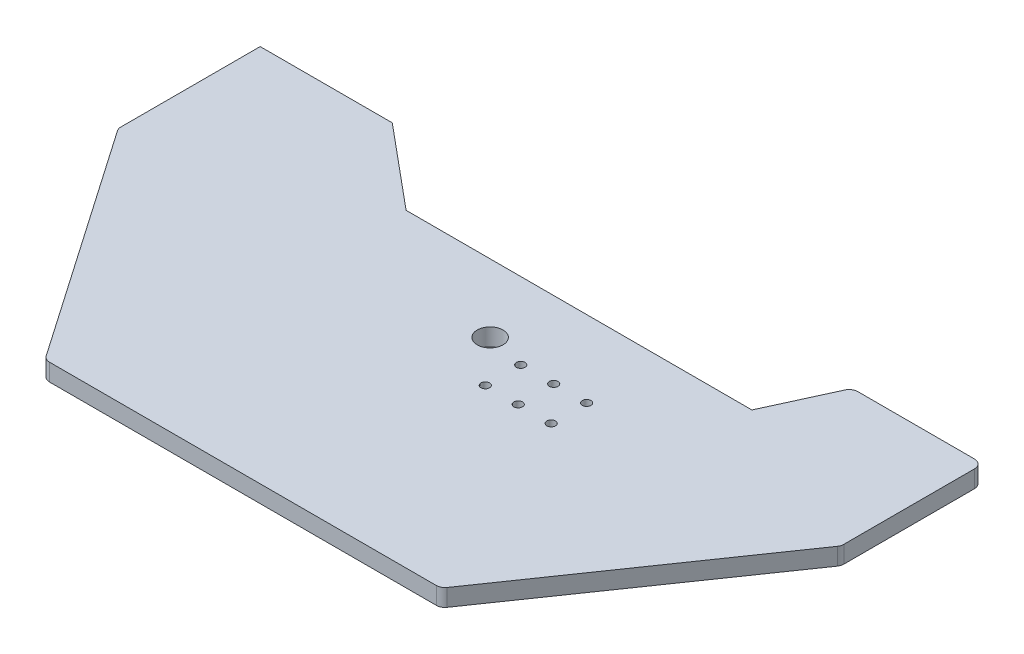
ISO-10303-21;
HEADER;
FILE_DESCRIPTION(('STEP AP214'),'2;1');
FILE_NAME('part.step','',(''),(''),'','','');
FILE_SCHEMA(('AUTOMOTIVE_DESIGN { 1 0 10303 214 1 1 1 1 }'));
ENDSEC;
DATA;
#1=APPLICATION_CONTEXT('core data for automotive mechanical design processes');
#2=APPLICATION_PROTOCOL_DEFINITION('international standard','automotive_design',2000,#1);
#3=PRODUCT_CONTEXT('',#1,'mechanical');
#4=PRODUCT('Part','Part','',(#3));
#5=PRODUCT_RELATED_PRODUCT_CATEGORY('part','',(#4));
#6=PRODUCT_DEFINITION_FORMATION('','',#4);
#7=PRODUCT_DEFINITION_CONTEXT('part definition',#1,'design');
#8=PRODUCT_DEFINITION('design','',#6,#7);
#9=PRODUCT_DEFINITION_SHAPE('','',#8);
#10=(LENGTH_UNIT() NAMED_UNIT(*) SI_UNIT(.MILLI.,.METRE.));
#11=(NAMED_UNIT(*) PLANE_ANGLE_UNIT() SI_UNIT($,.RADIAN.));
#12=(NAMED_UNIT(*) SI_UNIT($,.STERADIAN.) SOLID_ANGLE_UNIT());
#13=UNCERTAINTY_MEASURE_WITH_UNIT(LENGTH_MEASURE(1.E-05),#10,'distance_accuracy_value','');
#14=(GEOMETRIC_REPRESENTATION_CONTEXT(3) GLOBAL_UNCERTAINTY_ASSIGNED_CONTEXT((#13)) GLOBAL_UNIT_ASSIGNED_CONTEXT((#10,
#11,#12)) REPRESENTATION_CONTEXT('',''));
#15=CARTESIAN_POINT('',(0.,0.,0.));
#16=DIRECTION('',(0.,0.,1.));
#17=DIRECTION('',(1.,0.,0.));
#18=AXIS2_PLACEMENT_3D('',#15,#16,#17);
#19=CARTESIAN_POINT('',(-266.7,6.35,139.7));
#20=DIRECTION('',(0.,0.,-1.));
#21=DIRECTION('',(-1.,0.,0.));
#22=AXIS2_PLACEMENT_3D('',#19,#20,#21);
#23=PLANE('',#22);
#24=DIRECTION('',(1.,0.,0.));
#25=VECTOR('',#24,1.);
#26=CARTESIAN_POINT('',(-266.7,-6.35,139.7));
#27=LINE('',#26,#25);
#28=CARTESIAN_POINT('',(-142.719069440013,-6.35,139.7));
#29=VERTEX_POINT('',#28);
#30=CARTESIAN_POINT('',(142.719069440013,-6.35,139.7));
#31=VERTEX_POINT('',#30);
#32=EDGE_CURVE('E184',#29,#31,#27,.T.);
#33=ORIENTED_EDGE('',*,*,#32,.T.);
#34=DIRECTION('',(0.,1.,0.));
#35=VECTOR('',#34,1.);
#36=CARTESIAN_POINT('',(142.719069440013,6.35,139.7));
#37=LINE('',#36,#35);
#38=CARTESIAN_POINT('',(142.719069440013,6.35,139.7));
#39=VERTEX_POINT('',#38);
#40=EDGE_CURVE('E246',#31,#39,#37,.T.);
#41=ORIENTED_EDGE('',*,*,#40,.T.);
#42=DIRECTION('',(1.,0.,0.));
#43=VECTOR('',#42,1.);
#44=CARTESIAN_POINT('',(-266.7,6.35,139.7));
#45=LINE('',#44,#43);
#46=CARTESIAN_POINT('',(-142.719069440013,6.35,139.7));
#47=VERTEX_POINT('',#46);
#48=EDGE_CURVE('E306',#47,#39,#45,.T.);
#49=ORIENTED_EDGE('',*,*,#48,.F.);
#50=DIRECTION('',(0.,1.,0.));
#51=VECTOR('',#50,1.);
#52=CARTESIAN_POINT('',(-142.719069440013,6.35,139.7));
#53=LINE('',#52,#51);
#54=EDGE_CURVE('E244',#47,#29,#53,.F.);
#55=ORIENTED_EDGE('',*,*,#54,.T.);
#56=EDGE_LOOP('',(#33,#41,#49,#55));
#57=FACE_BOUND('',#56,.T.);
#58=ADVANCED_FACE('F33',(#57),#23,.F.);
#59=CARTESIAN_POINT('',(266.7,6.35,-139.7));
#60=DIRECTION('',(-1.,0.,0.));
#61=DIRECTION('',(0.,0.,1.));
#62=AXIS2_PLACEMENT_3D('',#59,#60,#61);
#63=PLANE('',#62);
#64=DIRECTION('',(0.,0.,-1.));
#65=VECTOR('',#64,1.);
#66=CARTESIAN_POINT('',(266.7,-6.35,-139.7));
#67=LINE('',#66,#65);
#68=CARTESIAN_POINT('',(266.7,-6.35,-36.9052942315606));
#69=VERTEX_POINT('',#68);
#70=CARTESIAN_POINT('',(266.7,-6.35,-133.35));
#71=VERTEX_POINT('',#70);
#72=EDGE_CURVE('E188',#69,#71,#67,.T.);
#73=ORIENTED_EDGE('',*,*,#72,.T.);
#74=DIRECTION('',(0.,-1.,0.));
#75=VECTOR('',#74,1.);
#76=CARTESIAN_POINT('',(266.7,6.35,-133.35));
#77=LINE('',#76,#75);
#78=CARTESIAN_POINT('',(266.7,6.35,-133.35));
#79=VERTEX_POINT('',#78);
#80=EDGE_CURVE('E237',#71,#79,#77,.F.);
#81=ORIENTED_EDGE('',*,*,#80,.T.);
#82=DIRECTION('',(0.,0.,-1.));
#83=VECTOR('',#82,1.);
#84=CARTESIAN_POINT('',(266.7,6.35,-139.7));
#85=LINE('',#84,#83);
#86=CARTESIAN_POINT('',(266.7,6.35,-36.9052942315606));
#87=VERTEX_POINT('',#86);
#88=EDGE_CURVE('E308',#87,#79,#85,.T.);
#89=ORIENTED_EDGE('',*,*,#88,.F.);
#90=DIRECTION('',(0.,1.,0.));
#91=VECTOR('',#90,1.);
#92=CARTESIAN_POINT('',(266.7,-6.35,-36.9052942315605));
#93=LINE('',#92,#91);
#94=EDGE_CURVE('E235',#87,#69,#93,.F.);
#95=ORIENTED_EDGE('',*,*,#94,.T.);
#96=EDGE_LOOP('',(#73,#81,#89,#95));
#97=FACE_BOUND('',#96,.T.);
#98=ADVANCED_FACE('F356',(#97),#63,.F.);
#99=CARTESIAN_POINT('',(0.,6.35,0.));
#100=DIRECTION('',(0.,-1.,0.));
#101=DIRECTION('',(0.,0.,-1.));
#102=AXIS2_PLACEMENT_3D('',#99,#100,#101);
#103=PLANE('',#102);
#104=CARTESIAN_POINT('',(3.99970691992363,6.35,-38.6754466523337));
#105=DIRECTION('',(0.,1.,0.));
#106=DIRECTION('',(0.,0.,1.));
#107=AXIS2_PLACEMENT_3D('',#104,#105,#106);
#108=CIRCLE('',#107,9.525);
#109=CARTESIAN_POINT('',(3.99970691992363,6.35,-29.1504466523337));
#110=VERTEX_POINT('',#109);
#111=EDGE_CURVE('E608',#110,#110,#108,.T.);
#112=ORIENTED_EDGE('',*,*,#111,.F.);
#113=EDGE_LOOP('',(#112));
#114=FACE_BOUND('',#113,.T.);
#115=CARTESIAN_POINT('',(81.4832,6.35,-6.24839999999997));
#116=DIRECTION('',(0.,1.,0.));
#117=DIRECTION('',(0.,0.,1.));
#118=AXIS2_PLACEMENT_3D('',#115,#116,#117);
#119=CIRCLE('',#118,3.175);
#120=CARTESIAN_POINT('',(81.4832,6.35,-3.07339999999998));
#121=VERTEX_POINT('',#120);
#122=EDGE_CURVE('E292',#121,#121,#119,.T.);
#123=ORIENTED_EDGE('',*,*,#122,.F.);
#124=EDGE_LOOP('',(#123));
#125=FACE_BOUND('',#124,.T.);
#126=CARTESIAN_POINT('',(81.4832,6.35,-32.4104));
#127=DIRECTION('',(0.,1.,0.));
#128=DIRECTION('',(0.,0.,1.));
#129=AXIS2_PLACEMENT_3D('',#126,#127,#128);
#130=CIRCLE('',#129,3.175);
#131=CARTESIAN_POINT('',(81.4832,6.35,-29.2354));
#132=VERTEX_POINT('',#131);
#133=EDGE_CURVE('E293',#132,#132,#130,.T.);
#134=ORIENTED_EDGE('',*,*,#133,.F.);
#135=EDGE_LOOP('',(#134));
#136=FACE_BOUND('',#135,.T.);
#137=CARTESIAN_POINT('',(57.1627,6.35,-32.4104));
#138=DIRECTION('',(0.,1.,0.));
#139=DIRECTION('',(0.,0.,1.));
#140=AXIS2_PLACEMENT_3D('',#137,#138,#139);
#141=CIRCLE('',#140,3.175);
#142=CARTESIAN_POINT('',(57.1627,6.35,-29.2354));
#143=VERTEX_POINT('',#142);
#144=EDGE_CURVE('E274',#143,#143,#141,.T.);
#145=ORIENTED_EDGE('',*,*,#144,.F.);
#146=EDGE_LOOP('',(#145));
#147=FACE_BOUND('',#146,.T.);
#148=CARTESIAN_POINT('',(32.8422,6.35,-32.4104));
#149=DIRECTION('',(0.,1.,0.));
#150=DIRECTION('',(0.,0.,1.));
#151=AXIS2_PLACEMENT_3D('',#148,#149,#150);
#152=CIRCLE('',#151,3.175);
#153=CARTESIAN_POINT('',(32.8422,6.35,-29.2354));
#154=VERTEX_POINT('',#153);
#155=EDGE_CURVE('E275',#154,#154,#152,.T.);
#156=ORIENTED_EDGE('',*,*,#155,.F.);
#157=EDGE_LOOP('',(#156));
#158=FACE_BOUND('',#157,.T.);
#159=CARTESIAN_POINT('',(32.8422,6.35,-6.24839999999997));
#160=DIRECTION('',(0.,1.,0.));
#161=DIRECTION('',(0.,0.,1.));
#162=AXIS2_PLACEMENT_3D('',#159,#160,#161);
#163=CIRCLE('',#162,3.175);
#164=CARTESIAN_POINT('',(32.8422,6.35,-3.07339999999998));
#165=VERTEX_POINT('',#164);
#166=EDGE_CURVE('E281',#165,#165,#163,.T.);
#167=ORIENTED_EDGE('',*,*,#166,.F.);
#168=EDGE_LOOP('',(#167));
#169=FACE_BOUND('',#168,.T.);
#170=CARTESIAN_POINT('',(57.1627,6.35,-6.24839999999998));
#171=DIRECTION('',(0.,1.,0.));
#172=DIRECTION('',(0.,0.,1.));
#173=AXIS2_PLACEMENT_3D('',#170,#171,#172);
#174=CIRCLE('',#173,3.175);
#175=CARTESIAN_POINT('',(57.1627,6.35,-3.07339999999998));
#176=VERTEX_POINT('',#175);
#177=EDGE_CURVE('E264',#176,#176,#174,.T.);
#178=ORIENTED_EDGE('',*,*,#177,.F.);
#179=EDGE_LOOP('',(#178));
#180=FACE_BOUND('',#179,.T.);
#181=DIRECTION('',(-1.,0.,0.));
#182=VECTOR('',#181,1.);
#183=CARTESIAN_POINT('',(170.18,6.35,-139.7));
#184=LINE('',#183,#182);
#185=CARTESIAN_POINT('',(260.35,6.35,-139.7));
#186=VERTEX_POINT('',#185);
#187=CARTESIAN_POINT('',(174.257872298125,6.35,-139.7));
#188=VERTEX_POINT('',#187);
#189=EDGE_CURVE('E158',#186,#188,#184,.T.);
#190=ORIENTED_EDGE('',*,*,#189,.T.);
#191=CARTESIAN_POINT('',(174.257872298125,6.35,-133.35));
#192=DIRECTION('',(0.,-1.,0.));
#193=DIRECTION('',(0.,0.,-1.));
#194=AXIS2_PLACEMENT_3D('',#191,#192,#193);
#195=CIRCLE('',#194,6.35);
#196=CARTESIAN_POINT('',(168.483489425197,6.35,-135.991780164365));
#197=VERTEX_POINT('',#196);
#198=EDGE_CURVE('E154',#188,#197,#195,.F.);
#199=ORIENTED_EDGE('',*,*,#198,.T.);
#200=DIRECTION('',(-0.416028372340905,0.,0.909351633532033));
#201=VECTOR('',#200,1.);
#202=CARTESIAN_POINT('',(146.939,6.35,-88.9));
#203=LINE('',#202,#201);
#204=CARTESIAN_POINT('',(146.939,6.35,-88.9));
#205=VERTEX_POINT('',#204);
#206=EDGE_CURVE('E146',#197,#205,#203,.T.);
#207=ORIENTED_EDGE('',*,*,#206,.T.);
#208=DIRECTION('',(-1.,0.,0.));
#209=VECTOR('',#208,1.);
#210=CARTESIAN_POINT('',(-108.237741638452,6.35,-88.9));
#211=LINE('',#210,#209);
#212=CARTESIAN_POINT('',(-108.237741638452,6.35,-88.9));
#213=VERTEX_POINT('',#212);
#214=EDGE_CURVE('E151',#205,#213,#211,.T.);
#215=ORIENTED_EDGE('',*,*,#214,.T.);
#216=DIRECTION('',(-0.768374908491942,0.,-0.64));
#217=VECTOR('',#216,1.);
#218=CARTESIAN_POINT('',(-169.2275,6.35,-139.7));
#219=LINE('',#218,#217);
#220=CARTESIAN_POINT('',(-169.2275,6.35,-139.7));
#221=VERTEX_POINT('',#220);
#222=EDGE_CURVE('E173',#213,#221,#219,.T.);
#223=ORIENTED_EDGE('',*,*,#222,.T.);
#224=DIRECTION('',(-1.,0.,0.));
#225=VECTOR('',#224,1.);
#226=CARTESIAN_POINT('',(-266.7,6.35,-139.7));
#227=LINE('',#226,#225);
#228=CARTESIAN_POINT('',(-266.7,6.35,-139.7));
#229=VERTEX_POINT('',#228);
#230=EDGE_CURVE('E175',#221,#229,#227,.T.);
#231=ORIENTED_EDGE('',*,*,#230,.T.);
#232=DIRECTION('',(0.,0.,1.));
#233=VECTOR('',#232,1.);
#234=CARTESIAN_POINT('',(-266.7,6.35,139.7));
#235=LINE('',#234,#233);
#236=CARTESIAN_POINT('',(-266.7,6.35,-36.9052942315606));
#237=VERTEX_POINT('',#236);
#238=EDGE_CURVE('E201',#229,#237,#235,.T.);
#239=ORIENTED_EDGE('',*,*,#238,.T.);
#240=CARTESIAN_POINT('',(-260.35,6.35,-36.9052942315606));
#241=DIRECTION('',(0.,-1.,0.));
#242=DIRECTION('',(0.,0.,-1.));
#243=AXIS2_PLACEMENT_3D('',#240,#241,#242);
#244=CIRCLE('',#243,6.35);
#245=CARTESIAN_POINT('',(-265.574337646892,6.35,-33.2957518573441));
#246=VERTEX_POINT('',#245);
#247=EDGE_CURVE('E226',#237,#246,#244,.F.);
#248=ORIENTED_EDGE('',*,*,#247,.T.);
#249=DIRECTION('',(-0.568431869955349,0.,-0.822730338093269));
#250=VECTOR('',#249,1.);
#251=CARTESIAN_POINT('',(-266.7,6.35,-34.925));
#252=LINE('',#251,#250);
#253=CARTESIAN_POINT('',(-147.943407086905,6.35,136.959542374217));
#254=VERTEX_POINT('',#253);
#255=EDGE_CURVE('E255',#254,#246,#252,.T.);
#256=ORIENTED_EDGE('',*,*,#255,.F.);
#257=CARTESIAN_POINT('',(-142.719069440013,6.35,133.35));
#258=DIRECTION('',(0.,-1.,0.));
#259=DIRECTION('',(0.,0.,-1.));
#260=AXIS2_PLACEMENT_3D('',#257,#258,#259);
#261=CIRCLE('',#260,6.35);
#262=EDGE_CURVE('E56',#254,#47,#261,.F.);
#263=ORIENTED_EDGE('',*,*,#262,.T.);
#264=ORIENTED_EDGE('',*,*,#48,.T.);
#265=CARTESIAN_POINT('',(142.719069440013,6.35,133.35));
#266=DIRECTION('',(0.,-1.,0.));
#267=DIRECTION('',(0.,0.,-1.));
#268=AXIS2_PLACEMENT_3D('',#265,#266,#267);
#269=CIRCLE('',#268,6.35);
#270=CARTESIAN_POINT('',(147.943407086905,6.35,136.959542374217));
#271=VERTEX_POINT('',#270);
#272=EDGE_CURVE('E48',#39,#271,#269,.F.);
#273=ORIENTED_EDGE('',*,*,#272,.T.);
#274=DIRECTION('',(0.568431869955349,0.,-0.822730338093269));
#275=VECTOR('',#274,1.);
#276=CARTESIAN_POINT('',(266.7,6.35,-34.925));
#277=LINE('',#276,#275);
#278=CARTESIAN_POINT('',(265.574337646892,6.35,-33.2957518573441));
#279=VERTEX_POINT('',#278);
#280=EDGE_CURVE('E267',#271,#279,#277,.T.);
#281=ORIENTED_EDGE('',*,*,#280,.T.);
#282=CARTESIAN_POINT('',(260.35,6.35,-36.9052942315605));
#283=DIRECTION('',(0.,-1.,0.));
#284=DIRECTION('',(0.,0.,-1.));
#285=AXIS2_PLACEMENT_3D('',#282,#283,#284);
#286=CIRCLE('',#285,6.35);
#287=EDGE_CURVE('E230',#279,#87,#286,.F.);
#288=ORIENTED_EDGE('',*,*,#287,.T.);
#289=ORIENTED_EDGE('',*,*,#88,.T.);
#290=CARTESIAN_POINT('',(260.35,6.35,-133.35));
#291=DIRECTION('',(0.,-1.,0.));
#292=DIRECTION('',(0.,0.,-1.));
#293=AXIS2_PLACEMENT_3D('',#290,#291,#292);
#294=CIRCLE('',#293,6.35);
#295=EDGE_CURVE('E232',#79,#186,#294,.F.);
#296=ORIENTED_EDGE('',*,*,#295,.T.);
#297=EDGE_LOOP('',(#190,#199,#207,#215,#223,#231,#239,#248,#256,#263,#264,#273,#281,#288,#289,#296));
#298=FACE_BOUND('',#297,.T.);
#299=ADVANCED_FACE('F149',(#114,#125,#136,#147,#158,#169,#180,#298),#103,.F.);
#300=CARTESIAN_POINT('',(0.,-6.35,0.));
#301=DIRECTION('',(0.,-1.,0.));
#302=DIRECTION('',(0.,0.,-1.));
#303=AXIS2_PLACEMENT_3D('',#300,#301,#302);
#304=PLANE('',#303);
#305=CARTESIAN_POINT('',(3.99970691992363,-6.35,-38.6754466523337));
#306=DIRECTION('',(0.,1.,0.));
#307=DIRECTION('',(0.,0.,1.));
#308=AXIS2_PLACEMENT_3D('',#305,#306,#307);
#309=CIRCLE('',#308,9.525);
#310=CARTESIAN_POINT('',(3.99970691992363,-6.35,-29.1504466523337));
#311=VERTEX_POINT('',#310);
#312=EDGE_CURVE('E346',#311,#311,#309,.T.);
#313=ORIENTED_EDGE('',*,*,#312,.T.);
#314=EDGE_LOOP('',(#313));
#315=FACE_BOUND('',#314,.T.);
#316=CARTESIAN_POINT('',(57.1627,-6.35,-6.24839999999998));
#317=DIRECTION('',(0.,1.,0.));
#318=DIRECTION('',(0.,0.,1.));
#319=AXIS2_PLACEMENT_3D('',#316,#317,#318);
#320=CIRCLE('',#319,3.175);
#321=CARTESIAN_POINT('',(57.1627,-6.35,-3.07339999999998));
#322=VERTEX_POINT('',#321);
#323=EDGE_CURVE('E284',#322,#322,#320,.T.);
#324=ORIENTED_EDGE('',*,*,#323,.T.);
#325=EDGE_LOOP('',(#324));
#326=FACE_BOUND('',#325,.T.);
#327=CARTESIAN_POINT('',(32.8422,-6.35,-6.24839999999997));
#328=DIRECTION('',(0.,1.,0.));
#329=DIRECTION('',(0.,0.,1.));
#330=AXIS2_PLACEMENT_3D('',#327,#328,#329);
#331=CIRCLE('',#330,3.175);
#332=CARTESIAN_POINT('',(32.8422,-6.35,-3.07339999999998));
#333=VERTEX_POINT('',#332);
#334=EDGE_CURVE('E278',#333,#333,#331,.T.);
#335=ORIENTED_EDGE('',*,*,#334,.T.);
#336=EDGE_LOOP('',(#335));
#337=FACE_BOUND('',#336,.T.);
#338=CARTESIAN_POINT('',(32.8422,-6.35,-32.4104));
#339=DIRECTION('',(0.,1.,0.));
#340=DIRECTION('',(0.,0.,1.));
#341=AXIS2_PLACEMENT_3D('',#338,#339,#340);
#342=CIRCLE('',#341,3.175);
#343=CARTESIAN_POINT('',(32.8422,-6.35,-29.2354));
#344=VERTEX_POINT('',#343);
#345=EDGE_CURVE('E271',#344,#344,#342,.T.);
#346=ORIENTED_EDGE('',*,*,#345,.T.);
#347=EDGE_LOOP('',(#346));
#348=FACE_BOUND('',#347,.T.);
#349=CARTESIAN_POINT('',(57.1627,-6.35,-32.4104));
#350=DIRECTION('',(0.,1.,0.));
#351=DIRECTION('',(0.,0.,1.));
#352=AXIS2_PLACEMENT_3D('',#349,#350,#351);
#353=CIRCLE('',#352,3.175);
#354=CARTESIAN_POINT('',(57.1627,-6.35,-29.2354));
#355=VERTEX_POINT('',#354);
#356=EDGE_CURVE('E296',#355,#355,#353,.T.);
#357=ORIENTED_EDGE('',*,*,#356,.T.);
#358=EDGE_LOOP('',(#357));
#359=FACE_BOUND('',#358,.T.);
#360=CARTESIAN_POINT('',(81.4832,-6.35,-32.4104));
#361=DIRECTION('',(0.,1.,0.));
#362=DIRECTION('',(0.,0.,1.));
#363=AXIS2_PLACEMENT_3D('',#360,#361,#362);
#364=CIRCLE('',#363,3.175);
#365=CARTESIAN_POINT('',(81.4832,-6.35,-29.2354));
#366=VERTEX_POINT('',#365);
#367=EDGE_CURVE('E289',#366,#366,#364,.T.);
#368=ORIENTED_EDGE('',*,*,#367,.T.);
#369=EDGE_LOOP('',(#368));
#370=FACE_BOUND('',#369,.T.);
#371=CARTESIAN_POINT('',(81.4832,-6.35,-6.24839999999997));
#372=DIRECTION('',(0.,1.,0.));
#373=DIRECTION('',(0.,0.,1.));
#374=AXIS2_PLACEMENT_3D('',#371,#372,#373);
#375=CIRCLE('',#374,3.175);
#376=CARTESIAN_POINT('',(81.4832,-6.35,-3.07339999999998));
#377=VERTEX_POINT('',#376);
#378=EDGE_CURVE('E185',#377,#377,#375,.T.);
#379=ORIENTED_EDGE('',*,*,#378,.T.);
#380=EDGE_LOOP('',(#379));
#381=FACE_BOUND('',#380,.T.);
#382=DIRECTION('',(-0.416028372340905,0.,0.909351633532033));
#383=VECTOR('',#382,1.);
#384=CARTESIAN_POINT('',(146.939,-6.35,-88.9));
#385=LINE('',#384,#383);
#386=CARTESIAN_POINT('',(168.483489425197,-6.35,-135.991780164365));
#387=VERTEX_POINT('',#386);
#388=CARTESIAN_POINT('',(146.939,-6.35,-88.9));
#389=VERTEX_POINT('',#388);
#390=EDGE_CURVE('E164',#387,#389,#385,.T.);
#391=ORIENTED_EDGE('',*,*,#390,.F.);
#392=CARTESIAN_POINT('',(174.257872298125,-6.35,-133.35));
#393=DIRECTION('',(0.,-1.,0.));
#394=DIRECTION('',(0.,0.,-1.));
#395=AXIS2_PLACEMENT_3D('',#392,#393,#394);
#396=CIRCLE('',#395,6.35);
#397=CARTESIAN_POINT('',(174.257872298125,-6.35,-139.7));
#398=VERTEX_POINT('',#397);
#399=EDGE_CURVE('E219',#387,#398,#396,.T.);
#400=ORIENTED_EDGE('',*,*,#399,.T.);
#401=DIRECTION('',(-1.,0.,0.));
#402=VECTOR('',#401,1.);
#403=CARTESIAN_POINT('',(170.18,-6.35,-139.7));
#404=LINE('',#403,#402);
#405=CARTESIAN_POINT('',(260.35,-6.35,-139.7));
#406=VERTEX_POINT('',#405);
#407=EDGE_CURVE('E191',#406,#398,#404,.T.);
#408=ORIENTED_EDGE('',*,*,#407,.F.);
#409=CARTESIAN_POINT('',(260.35,-6.35,-133.35));
#410=DIRECTION('',(0.,-1.,0.));
#411=DIRECTION('',(0.,0.,-1.));
#412=AXIS2_PLACEMENT_3D('',#409,#410,#411);
#413=CIRCLE('',#412,6.35);
#414=EDGE_CURVE('E217',#406,#71,#413,.T.);
#415=ORIENTED_EDGE('',*,*,#414,.T.);
#416=ORIENTED_EDGE('',*,*,#72,.F.);
#417=CARTESIAN_POINT('',(260.35,-6.35,-36.9052942315605));
#418=DIRECTION('',(0.,-1.,0.));
#419=DIRECTION('',(0.,0.,-1.));
#420=AXIS2_PLACEMENT_3D('',#417,#418,#419);
#421=CIRCLE('',#420,6.35);
#422=CARTESIAN_POINT('',(265.574337646892,-6.35,-33.2957518573441));
#423=VERTEX_POINT('',#422);
#424=EDGE_CURVE('E215',#69,#423,#421,.T.);
#425=ORIENTED_EDGE('',*,*,#424,.T.);
#426=DIRECTION('',(0.568431869955349,0.,-0.822730338093269));
#427=VECTOR('',#426,1.);
#428=CARTESIAN_POINT('',(266.7,-6.35,-34.925));
#429=LINE('',#428,#427);
#430=CARTESIAN_POINT('',(147.943407086905,-6.35,136.959542374217));
#431=VERTEX_POINT('',#430);
#432=EDGE_CURVE('E262',#431,#423,#429,.T.);
#433=ORIENTED_EDGE('',*,*,#432,.F.);
#434=CARTESIAN_POINT('',(142.719069440013,-6.35,133.35));
#435=DIRECTION('',(0.,-1.,0.));
#436=DIRECTION('',(0.,0.,-1.));
#437=AXIS2_PLACEMENT_3D('',#434,#435,#436);
#438=CIRCLE('',#437,6.35);
#439=EDGE_CURVE('E213',#431,#31,#438,.T.);
#440=ORIENTED_EDGE('',*,*,#439,.T.);
#441=ORIENTED_EDGE('',*,*,#32,.F.);
#442=CARTESIAN_POINT('',(-142.719069440013,-6.35,133.35));
#443=DIRECTION('',(0.,-1.,0.));
#444=DIRECTION('',(0.,0.,-1.));
#445=AXIS2_PLACEMENT_3D('',#442,#443,#444);
#446=CIRCLE('',#445,6.35);
#447=CARTESIAN_POINT('',(-147.943407086905,-6.35,136.959542374217));
#448=VERTEX_POINT('',#447);
#449=EDGE_CURVE('E211',#29,#448,#446,.T.);
#450=ORIENTED_EDGE('',*,*,#449,.T.);
#451=DIRECTION('',(-0.568431869955349,0.,-0.822730338093269));
#452=VECTOR('',#451,1.);
#453=CARTESIAN_POINT('',(-266.7,-6.35,-34.925));
#454=LINE('',#453,#452);
#455=CARTESIAN_POINT('',(-265.574337646892,-6.35,-33.2957518573441));
#456=VERTEX_POINT('',#455);
#457=EDGE_CURVE('E258',#448,#456,#454,.T.);
#458=ORIENTED_EDGE('',*,*,#457,.T.);
#459=CARTESIAN_POINT('',(-260.35,-6.35,-36.9052942315606));
#460=DIRECTION('',(0.,-1.,0.));
#461=DIRECTION('',(0.,0.,-1.));
#462=AXIS2_PLACEMENT_3D('',#459,#460,#461);
#463=CIRCLE('',#462,6.35);
#464=CARTESIAN_POINT('',(-266.7,-6.35,-36.9052942315606));
#465=VERTEX_POINT('',#464);
#466=EDGE_CURVE('E209',#456,#465,#463,.T.);
#467=ORIENTED_EDGE('',*,*,#466,.T.);
#468=DIRECTION('',(0.,0.,1.));
#469=VECTOR('',#468,1.);
#470=CARTESIAN_POINT('',(-266.7,-6.35,139.7));
#471=LINE('',#470,#469);
#472=CARTESIAN_POINT('',(-266.7,-6.35,-139.7));
#473=VERTEX_POINT('',#472);
#474=EDGE_CURVE('E181',#473,#465,#471,.T.);
#475=ORIENTED_EDGE('',*,*,#474,.F.);
#476=DIRECTION('',(-1.,0.,0.));
#477=VECTOR('',#476,1.);
#478=CARTESIAN_POINT('',(-266.7,-6.35,-139.7));
#479=LINE('',#478,#477);
#480=CARTESIAN_POINT('',(-169.2275,-6.35,-139.7));
#481=VERTEX_POINT('',#480);
#482=EDGE_CURVE('E199',#481,#473,#479,.T.);
#483=ORIENTED_EDGE('',*,*,#482,.F.);
#484=DIRECTION('',(-0.768374908491942,0.,-0.64));
#485=VECTOR('',#484,1.);
#486=CARTESIAN_POINT('',(-169.2275,-6.35,-139.7));
#487=LINE('',#486,#485);
#488=CARTESIAN_POINT('',(-108.237741638452,-6.35,-88.9));
#489=VERTEX_POINT('',#488);
#490=EDGE_CURVE('E197',#489,#481,#487,.T.);
#491=ORIENTED_EDGE('',*,*,#490,.F.);
#492=DIRECTION('',(-1.,0.,0.));
#493=VECTOR('',#492,1.);
#494=CARTESIAN_POINT('',(-108.237741638452,-6.35,-88.9));
#495=LINE('',#494,#493);
#496=EDGE_CURVE('E195',#389,#489,#495,.T.);
#497=ORIENTED_EDGE('',*,*,#496,.F.);
#498=EDGE_LOOP('',(#391,#400,#408,#415,#416,#425,#433,#440,#441,#450,#458,#467,#475,#483,#491,#497));
#499=FACE_BOUND('',#498,.T.);
#500=ADVANCED_FACE('F318',(#315,#326,#337,#348,#359,#370,#381,#499),#304,.T.);
#501=CARTESIAN_POINT('',(-266.7,6.35,139.7));
#502=DIRECTION('',(1.,0.,0.));
#503=DIRECTION('',(0.,0.,-1.));
#504=AXIS2_PLACEMENT_3D('',#501,#502,#503);
#505=PLANE('',#504);
#506=ORIENTED_EDGE('',*,*,#474,.T.);
#507=DIRECTION('',(0.,1.,0.));
#508=VECTOR('',#507,1.);
#509=CARTESIAN_POINT('',(-266.7,6.35,-36.9052942315606));
#510=LINE('',#509,#508);
#511=EDGE_CURVE('E11',#465,#237,#510,.T.);
#512=ORIENTED_EDGE('',*,*,#511,.T.);
#513=ORIENTED_EDGE('',*,*,#238,.F.);
#514=DIRECTION('',(0.,-1.,0.));
#515=VECTOR('',#514,1.);
#516=CARTESIAN_POINT('',(-266.7,6.35,-139.7));
#517=LINE('',#516,#515);
#518=EDGE_CURVE('E180',#229,#473,#517,.T.);
#519=ORIENTED_EDGE('',*,*,#518,.T.);
#520=EDGE_LOOP('',(#506,#512,#513,#519));
#521=FACE_BOUND('',#520,.T.);
#522=ADVANCED_FACE('F332',(#521),#505,.F.);
#523=CARTESIAN_POINT('',(170.18,6.35,-139.7));
#524=DIRECTION('',(0.,0.,1.));
#525=DIRECTION('',(1.,0.,0.));
#526=AXIS2_PLACEMENT_3D('',#523,#524,#525);
#527=PLANE('',#526);
#528=ORIENTED_EDGE('',*,*,#407,.T.);
#529=DIRECTION('',(0.,-1.,0.));
#530=VECTOR('',#529,1.);
#531=CARTESIAN_POINT('',(174.257872298125,6.35,-139.7));
#532=LINE('',#531,#530);
#533=EDGE_CURVE('E224',#398,#188,#532,.F.);
#534=ORIENTED_EDGE('',*,*,#533,.T.);
#535=ORIENTED_EDGE('',*,*,#189,.F.);
#536=DIRECTION('',(0.,-1.,0.));
#537=VECTOR('',#536,1.);
#538=CARTESIAN_POINT('',(260.35,6.35,-139.7));
#539=LINE('',#538,#537);
#540=EDGE_CURVE('E221',#186,#406,#539,.T.);
#541=ORIENTED_EDGE('',*,*,#540,.T.);
#542=EDGE_LOOP('',(#528,#534,#535,#541));
#543=FACE_BOUND('',#542,.T.);
#544=ADVANCED_FACE('F360',(#543),#527,.F.);
#545=CARTESIAN_POINT('',(146.939,6.35,-88.9));
#546=DIRECTION('',(0.909351633532033,0.,0.416028372340905));
#547=DIRECTION('',(0.416028372340905,0.,-0.909351633532033));
#548=AXIS2_PLACEMENT_3D('',#545,#546,#547);
#549=PLANE('',#548);
#550=ORIENTED_EDGE('',*,*,#206,.F.);
#551=DIRECTION('',(0.,-1.,0.));
#552=VECTOR('',#551,1.);
#553=CARTESIAN_POINT('',(168.483489425197,6.35,-135.991780164365));
#554=LINE('',#553,#552);
#555=EDGE_CURVE('E167',#197,#387,#554,.T.);
#556=ORIENTED_EDGE('',*,*,#555,.T.);
#557=ORIENTED_EDGE('',*,*,#390,.T.);
#558=DIRECTION('',(0.,-1.,0.));
#559=VECTOR('',#558,1.);
#560=CARTESIAN_POINT('',(146.939,6.35,-88.9));
#561=LINE('',#560,#559);
#562=EDGE_CURVE('E161',#205,#389,#561,.T.);
#563=ORIENTED_EDGE('',*,*,#562,.F.);
#564=EDGE_LOOP('',(#550,#556,#557,#563));
#565=FACE_BOUND('',#564,.T.);
#566=ADVANCED_FACE('F162',(#565),#549,.F.);
#567=CARTESIAN_POINT('',(-108.237741638452,6.35,-88.9));
#568=DIRECTION('',(0.,0.,1.));
#569=DIRECTION('',(1.,0.,0.));
#570=AXIS2_PLACEMENT_3D('',#567,#568,#569);
#571=PLANE('',#570);
#572=ORIENTED_EDGE('',*,*,#496,.T.);
#573=DIRECTION('',(0.,-1.,0.));
#574=VECTOR('',#573,1.);
#575=CARTESIAN_POINT('',(-108.237741638452,6.35,-88.9));
#576=LINE('',#575,#574);
#577=EDGE_CURVE('E168',#213,#489,#576,.T.);
#578=ORIENTED_EDGE('',*,*,#577,.F.);
#579=ORIENTED_EDGE('',*,*,#214,.F.);
#580=ORIENTED_EDGE('',*,*,#562,.T.);
#581=EDGE_LOOP('',(#572,#578,#579,#580));
#582=FACE_BOUND('',#581,.T.);
#583=ADVANCED_FACE('F170',(#582),#571,.F.);
#584=CARTESIAN_POINT('',(-169.2275,6.35,-139.7));
#585=DIRECTION('',(-0.64,0.,0.768374908491942));
#586=DIRECTION('',(0.768374908491942,0.,0.64));
#587=AXIS2_PLACEMENT_3D('',#584,#585,#586);
#588=PLANE('',#587);
#589=ORIENTED_EDGE('',*,*,#490,.T.);
#590=DIRECTION('',(0.,-1.,0.));
#591=VECTOR('',#590,1.);
#592=CARTESIAN_POINT('',(-169.2275,6.35,-139.7));
#593=LINE('',#592,#591);
#594=EDGE_CURVE('E204',#221,#481,#593,.T.);
#595=ORIENTED_EDGE('',*,*,#594,.F.);
#596=ORIENTED_EDGE('',*,*,#222,.F.);
#597=ORIENTED_EDGE('',*,*,#577,.T.);
#598=EDGE_LOOP('',(#589,#595,#596,#597));
#599=FACE_BOUND('',#598,.T.);
#600=ADVANCED_FACE('F323',(#599),#588,.F.);
#601=CARTESIAN_POINT('',(-266.7,6.35,-139.7));
#602=DIRECTION('',(0.,0.,1.));
#603=DIRECTION('',(1.,0.,0.));
#604=AXIS2_PLACEMENT_3D('',#601,#602,#603);
#605=PLANE('',#604);
#606=ORIENTED_EDGE('',*,*,#482,.T.);
#607=ORIENTED_EDGE('',*,*,#518,.F.);
#608=ORIENTED_EDGE('',*,*,#230,.F.);
#609=ORIENTED_EDGE('',*,*,#594,.T.);
#610=EDGE_LOOP('',(#606,#607,#608,#609));
#611=FACE_BOUND('',#610,.T.);
#612=ADVANCED_FACE('F329',(#611),#605,.F.);
#613=CARTESIAN_POINT('',(81.4832,-6.35,-6.24839999999997));
#614=DIRECTION('',(0.,1.,0.));
#615=DIRECTION('',(0.,0.,1.));
#616=AXIS2_PLACEMENT_3D('',#613,#614,#615);
#617=CYLINDRICAL_SURFACE('',#616,3.175);
#618=ORIENTED_EDGE('',*,*,#378,.F.);
#619=EDGE_LOOP('',(#618));
#620=FACE_BOUND('',#619,.T.);
#621=ORIENTED_EDGE('',*,*,#122,.T.);
#622=EDGE_LOOP('',(#621));
#623=FACE_BOUND('',#622,.T.);
#624=ADVANCED_FACE('F418',(#620,#623),#617,.F.);
#625=CARTESIAN_POINT('',(81.4832,-6.35,-32.4104));
#626=DIRECTION('',(0.,1.,0.));
#627=DIRECTION('',(0.,0.,1.));
#628=AXIS2_PLACEMENT_3D('',#625,#626,#627);
#629=CYLINDRICAL_SURFACE('',#628,3.175);
#630=ORIENTED_EDGE('',*,*,#367,.F.);
#631=EDGE_LOOP('',(#630));
#632=FACE_BOUND('',#631,.T.);
#633=ORIENTED_EDGE('',*,*,#133,.T.);
#634=EDGE_LOOP('',(#633));
#635=FACE_BOUND('',#634,.T.);
#636=ADVANCED_FACE('F415',(#632,#635),#629,.F.);
#637=CARTESIAN_POINT('',(57.1627,-6.35,-32.4104));
#638=DIRECTION('',(0.,1.,0.));
#639=DIRECTION('',(0.,0.,1.));
#640=AXIS2_PLACEMENT_3D('',#637,#638,#639);
#641=CYLINDRICAL_SURFACE('',#640,3.175);
#642=ORIENTED_EDGE('',*,*,#356,.F.);
#643=EDGE_LOOP('',(#642));
#644=FACE_BOUND('',#643,.T.);
#645=ORIENTED_EDGE('',*,*,#144,.T.);
#646=EDGE_LOOP('',(#645));
#647=FACE_BOUND('',#646,.T.);
#648=ADVANCED_FACE('F407',(#644,#647),#641,.F.);
#649=CARTESIAN_POINT('',(32.8422,-6.35,-32.4104));
#650=DIRECTION('',(0.,1.,0.));
#651=DIRECTION('',(0.,0.,1.));
#652=AXIS2_PLACEMENT_3D('',#649,#650,#651);
#653=CYLINDRICAL_SURFACE('',#652,3.175);
#654=ORIENTED_EDGE('',*,*,#345,.F.);
#655=EDGE_LOOP('',(#654));
#656=FACE_BOUND('',#655,.T.);
#657=ORIENTED_EDGE('',*,*,#155,.T.);
#658=EDGE_LOOP('',(#657));
#659=FACE_BOUND('',#658,.T.);
#660=ADVANCED_FACE('F403',(#656,#659),#653,.F.);
#661=CARTESIAN_POINT('',(32.8422,-6.35,-6.24839999999997));
#662=DIRECTION('',(0.,1.,0.));
#663=DIRECTION('',(0.,0.,1.));
#664=AXIS2_PLACEMENT_3D('',#661,#662,#663);
#665=CYLINDRICAL_SURFACE('',#664,3.175);
#666=ORIENTED_EDGE('',*,*,#334,.F.);
#667=EDGE_LOOP('',(#666));
#668=FACE_BOUND('',#667,.T.);
#669=ORIENTED_EDGE('',*,*,#166,.T.);
#670=EDGE_LOOP('',(#669));
#671=FACE_BOUND('',#670,.T.);
#672=ADVANCED_FACE('F406',(#668,#671),#665,.F.);
#673=CARTESIAN_POINT('',(57.1627,-6.35,-6.24839999999998));
#674=DIRECTION('',(0.,1.,0.));
#675=DIRECTION('',(0.,0.,1.));
#676=AXIS2_PLACEMENT_3D('',#673,#674,#675);
#677=CYLINDRICAL_SURFACE('',#676,3.175);
#678=ORIENTED_EDGE('',*,*,#323,.F.);
#679=EDGE_LOOP('',(#678));
#680=FACE_BOUND('',#679,.T.);
#681=ORIENTED_EDGE('',*,*,#177,.T.);
#682=EDGE_LOOP('',(#681));
#683=FACE_BOUND('',#682,.T.);
#684=ADVANCED_FACE('F402',(#680,#683),#677,.F.);
#685=CARTESIAN_POINT('',(-266.7,-6.35,-34.925));
#686=DIRECTION('',(0.822730338093269,0.,-0.568431869955349));
#687=DIRECTION('',(-0.568431869955349,0.,-0.822730338093269));
#688=AXIS2_PLACEMENT_3D('',#685,#686,#687);
#689=PLANE('',#688);
#690=ORIENTED_EDGE('',*,*,#457,.F.);
#691=DIRECTION('',(0.,1.,0.));
#692=VECTOR('',#691,1.);
#693=CARTESIAN_POINT('',(-147.943407086905,-6.35,136.959542374216));
#694=LINE('',#693,#692);
#695=EDGE_CURVE('E41',#448,#254,#694,.T.);
#696=ORIENTED_EDGE('',*,*,#695,.T.);
#697=ORIENTED_EDGE('',*,*,#255,.T.);
#698=DIRECTION('',(0.,1.,0.));
#699=VECTOR('',#698,1.);
#700=CARTESIAN_POINT('',(-265.574337646892,-6.35,-33.2957518573441));
#701=LINE('',#700,#699);
#702=EDGE_CURVE('E248',#246,#456,#701,.F.);
#703=ORIENTED_EDGE('',*,*,#702,.T.);
#704=EDGE_LOOP('',(#690,#696,#697,#703));
#705=FACE_BOUND('',#704,.T.);
#706=ADVANCED_FACE('F254',(#705),#689,.F.);
#707=CARTESIAN_POINT('',(266.7,-6.35,-34.925));
#708=DIRECTION('',(0.822730338093269,0.,0.568431869955349));
#709=DIRECTION('',(0.568431869955349,0.,-0.822730338093269));
#710=AXIS2_PLACEMENT_3D('',#707,#708,#709);
#711=PLANE('',#710);
#712=ORIENTED_EDGE('',*,*,#432,.T.);
#713=DIRECTION('',(0.,1.,0.));
#714=VECTOR('',#713,1.);
#715=CARTESIAN_POINT('',(265.574337646892,6.35,-33.2957518573441));
#716=LINE('',#715,#714);
#717=EDGE_CURVE('E241',#423,#279,#716,.T.);
#718=ORIENTED_EDGE('',*,*,#717,.T.);
#719=ORIENTED_EDGE('',*,*,#280,.F.);
#720=DIRECTION('',(0.,1.,0.));
#721=VECTOR('',#720,1.);
#722=CARTESIAN_POINT('',(147.943407086905,-6.35,136.959542374216));
#723=LINE('',#722,#721);
#724=EDGE_CURVE('E239',#271,#431,#723,.F.);
#725=ORIENTED_EDGE('',*,*,#724,.T.);
#726=EDGE_LOOP('',(#712,#718,#719,#725));
#727=FACE_BOUND('',#726,.T.);
#728=ADVANCED_FACE('F343',(#727),#711,.T.);
#729=CARTESIAN_POINT('',(174.257872298125,6.35,-133.35));
#730=DIRECTION('',(0.,-1.,0.));
#731=DIRECTION('',(0.,0.,-1.));
#732=AXIS2_PLACEMENT_3D('',#729,#730,#731);
#733=CYLINDRICAL_SURFACE('',#732,6.35);
#734=ORIENTED_EDGE('',*,*,#198,.F.);
#735=ORIENTED_EDGE('',*,*,#533,.F.);
#736=ORIENTED_EDGE('',*,*,#399,.F.);
#737=ORIENTED_EDGE('',*,*,#555,.F.);
#738=EDGE_LOOP('',(#734,#735,#736,#737));
#739=FACE_BOUND('',#738,.T.);
#740=ADVANCED_FACE('F316',(#739),#733,.T.);
#741=CARTESIAN_POINT('',(260.35,6.35,-133.35));
#742=DIRECTION('',(0.,-1.,0.));
#743=DIRECTION('',(0.,0.,-1.));
#744=AXIS2_PLACEMENT_3D('',#741,#742,#743);
#745=CYLINDRICAL_SURFACE('',#744,6.35);
#746=ORIENTED_EDGE('',*,*,#295,.F.);
#747=ORIENTED_EDGE('',*,*,#80,.F.);
#748=ORIENTED_EDGE('',*,*,#414,.F.);
#749=ORIENTED_EDGE('',*,*,#540,.F.);
#750=EDGE_LOOP('',(#746,#747,#748,#749));
#751=FACE_BOUND('',#750,.T.);
#752=ADVANCED_FACE('F359',(#751),#745,.T.);
#753=CARTESIAN_POINT('',(260.35,-6.35,-36.9052942315605));
#754=DIRECTION('',(0.,-1.,0.));
#755=DIRECTION('',(0.,0.,-1.));
#756=AXIS2_PLACEMENT_3D('',#753,#754,#755);
#757=CYLINDRICAL_SURFACE('',#756,6.35);
#758=ORIENTED_EDGE('',*,*,#424,.F.);
#759=ORIENTED_EDGE('',*,*,#94,.F.);
#760=ORIENTED_EDGE('',*,*,#287,.F.);
#761=ORIENTED_EDGE('',*,*,#717,.F.);
#762=EDGE_LOOP('',(#758,#759,#760,#761));
#763=FACE_BOUND('',#762,.T.);
#764=ADVANCED_FACE('F352',(#763),#757,.T.);
#765=CARTESIAN_POINT('',(142.719069440013,6.35,133.35));
#766=DIRECTION('',(0.,-1.,0.));
#767=DIRECTION('',(0.,0.,-1.));
#768=AXIS2_PLACEMENT_3D('',#765,#766,#767);
#769=CYLINDRICAL_SURFACE('',#768,6.35);
#770=ORIENTED_EDGE('',*,*,#439,.F.);
#771=ORIENTED_EDGE('',*,*,#724,.F.);
#772=ORIENTED_EDGE('',*,*,#272,.F.);
#773=ORIENTED_EDGE('',*,*,#40,.F.);
#774=EDGE_LOOP('',(#770,#771,#772,#773));
#775=FACE_BOUND('',#774,.T.);
#776=ADVANCED_FACE('F348',(#775),#769,.T.);
#777=CARTESIAN_POINT('',(-142.719069440013,-6.35,133.35));
#778=DIRECTION('',(0.,1.,0.));
#779=DIRECTION('',(0.,0.,1.));
#780=AXIS2_PLACEMENT_3D('',#777,#778,#779);
#781=CYLINDRICAL_SURFACE('',#780,6.35);
#782=ORIENTED_EDGE('',*,*,#449,.F.);
#783=ORIENTED_EDGE('',*,*,#54,.F.);
#784=ORIENTED_EDGE('',*,*,#262,.F.);
#785=ORIENTED_EDGE('',*,*,#695,.F.);
#786=EDGE_LOOP('',(#782,#783,#784,#785));
#787=FACE_BOUND('',#786,.T.);
#788=ADVANCED_FACE('F338',(#787),#781,.T.);
#789=CARTESIAN_POINT('',(-260.35,6.35,-36.9052942315606));
#790=DIRECTION('',(0.,1.,0.));
#791=DIRECTION('',(0.,0.,1.));
#792=AXIS2_PLACEMENT_3D('',#789,#790,#791);
#793=CYLINDRICAL_SURFACE('',#792,6.35);
#794=ORIENTED_EDGE('',*,*,#466,.F.);
#795=ORIENTED_EDGE('',*,*,#702,.F.);
#796=ORIENTED_EDGE('',*,*,#247,.F.);
#797=ORIENTED_EDGE('',*,*,#511,.F.);
#798=EDGE_LOOP('',(#794,#795,#796,#797));
#799=FACE_BOUND('',#798,.T.);
#800=ADVANCED_FACE('F35',(#799),#793,.T.);
#801=CARTESIAN_POINT('',(3.99970691992363,-6.35,-38.6754466523337));
#802=DIRECTION('',(0.,1.,0.));
#803=DIRECTION('',(0.,0.,1.));
#804=AXIS2_PLACEMENT_3D('',#801,#802,#803);
#805=CYLINDRICAL_SURFACE('',#804,9.525);
#806=ORIENTED_EDGE('',*,*,#312,.F.);
#807=EDGE_LOOP('',(#806));
#808=FACE_BOUND('',#807,.T.);
#809=ORIENTED_EDGE('',*,*,#111,.T.);
#810=EDGE_LOOP('',(#809));
#811=FACE_BOUND('',#810,.T.);
#812=ADVANCED_FACE('F387',(#808,#811),#805,.F.);
#813=CLOSED_SHELL('',(#58,#98,#299,#500,#522,#544,#566,#583,#600,#612,#624,#636,#648,#660,#672,
#684,#706,#728,#740,#752,#764,#776,#788,#800,#812));
#814=MANIFOLD_SOLID_BREP('B2',#813);
#815=ADVANCED_BREP_SHAPE_REPRESENTATION('',(#18,#814),#14);
#816=SHAPE_DEFINITION_REPRESENTATION(#9,#815);
ENDSEC;
END-ISO-10303-21;
